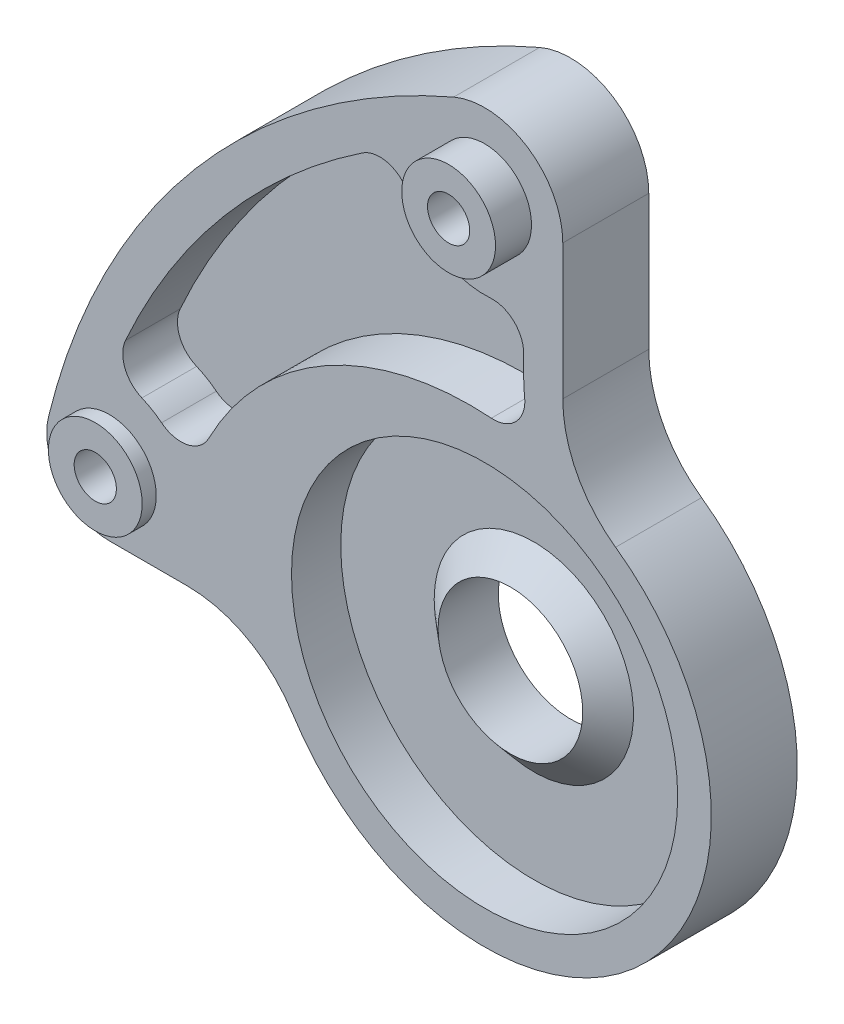
ISO-10303-21;
HEADER;
FILE_DESCRIPTION(('STEP AP214'),'2;1');
FILE_NAME('part.step','',(''),(''),'','','');
FILE_SCHEMA(('AUTOMOTIVE_DESIGN { 1 0 10303 214 1 1 1 1 }'));
ENDSEC;
DATA;
#1=APPLICATION_CONTEXT('core data for automotive mechanical design processes');
#2=APPLICATION_PROTOCOL_DEFINITION('international standard','automotive_design',2000,#1);
#3=PRODUCT_CONTEXT('',#1,'mechanical');
#4=PRODUCT('Part','Part','',(#3));
#5=PRODUCT_RELATED_PRODUCT_CATEGORY('part','',(#4));
#6=PRODUCT_DEFINITION_FORMATION('','',#4);
#7=PRODUCT_DEFINITION_CONTEXT('part definition',#1,'design');
#8=PRODUCT_DEFINITION('design','',#6,#7);
#9=PRODUCT_DEFINITION_SHAPE('','',#8);
#10=(LENGTH_UNIT() NAMED_UNIT(*) SI_UNIT(.MILLI.,.METRE.));
#11=(NAMED_UNIT(*) PLANE_ANGLE_UNIT() SI_UNIT($,.RADIAN.));
#12=(NAMED_UNIT(*) SI_UNIT($,.STERADIAN.) SOLID_ANGLE_UNIT());
#13=UNCERTAINTY_MEASURE_WITH_UNIT(LENGTH_MEASURE(1.E-05),#10,'distance_accuracy_value','');
#14=(GEOMETRIC_REPRESENTATION_CONTEXT(3) GLOBAL_UNCERTAINTY_ASSIGNED_CONTEXT((#13)) GLOBAL_UNIT_ASSIGNED_CONTEXT((#10,
#11,#12)) REPRESENTATION_CONTEXT('',''));
#15=CARTESIAN_POINT('',(0.,0.,0.));
#16=DIRECTION('',(0.,0.,1.));
#17=DIRECTION('',(1.,0.,0.));
#18=AXIS2_PLACEMENT_3D('',#15,#16,#17);
#19=CARTESIAN_POINT('',(0.,0.,2.35));
#20=DIRECTION('',(0.,0.,-1.));
#21=DIRECTION('',(-1.,0.,0.));
#22=AXIS2_PLACEMENT_3D('',#19,#20,#21);
#23=PLANE('',#22);
#24=CARTESIAN_POINT('',(0.,0.,2.35));
#25=DIRECTION('',(0.,0.,1.));
#26=DIRECTION('',(-1.,0.,0.));
#27=AXIS2_PLACEMENT_3D('',#24,#25,#26);
#28=CIRCLE('',#27,12.35);
#29=CARTESIAN_POINT('',(-12.35,0.,2.35));
#30=VERTEX_POINT('',#29);
#31=EDGE_CURVE('E199',#30,#30,#28,.T.);
#32=ORIENTED_EDGE('',*,*,#31,.T.);
#33=EDGE_LOOP('',(#32));
#34=FACE_BOUND('',#33,.T.);
#35=CARTESIAN_POINT('',(0.,0.,2.35));
#36=DIRECTION('',(0.,0.,-1.));
#37=DIRECTION('',(-1.,0.,0.));
#38=AXIS2_PLACEMENT_3D('',#35,#36,#37);
#39=CIRCLE('',#38,6.375);
#40=CARTESIAN_POINT('',(-6.375,0.,2.35));
#41=VERTEX_POINT('',#40);
#42=EDGE_CURVE('E11',#41,#41,#39,.F.);
#43=ORIENTED_EDGE('',*,*,#42,.F.);
#44=EDGE_LOOP('',(#43));
#45=FACE_BOUND('',#44,.T.);
#46=ADVANCED_FACE('F33',(#34,#45),#23,.F.);
#47=CARTESIAN_POINT('',(0.,0.,5.5));
#48=DIRECTION('',(0.,0.,1.));
#49=DIRECTION('',(1.,0.,0.));
#50=AXIS2_PLACEMENT_3D('',#47,#48,#49);
#51=PLANE('',#50);
#52=CARTESIAN_POINT('',(0.,0.,5.5));
#53=DIRECTION('',(0.,0.,1.));
#54=DIRECTION('',(1.,0.,0.));
#55=AXIS2_PLACEMENT_3D('',#52,#53,#54);
#56=CIRCLE('',#55,14.5);
#57=CARTESIAN_POINT('',(-12.2656249557679,-7.73333333333334,5.5));
#58=VERTEX_POINT('',#57);
#59=CARTESIAN_POINT('',(8.3777777777777,11.834814722089,5.5));
#60=VERTEX_POINT('',#59);
#61=EDGE_CURVE('E145',#58,#60,#56,.T.);
#62=ORIENTED_EDGE('',*,*,#61,.T.);
#63=CARTESIAN_POINT('',(13.,18.364367672207,5.5));
#64=DIRECTION('',(0.,0.,-1.));
#65=DIRECTION('',(-1.,0.,0.));
#66=AXIS2_PLACEMENT_3D('',#63,#64,#65);
#67=CIRCLE('',#66,8.00000000000009);
#68=CARTESIAN_POINT('',(4.99999999999991,18.364367672207,5.5));
#69=VERTEX_POINT('',#68);
#70=EDGE_CURVE('E148',#60,#69,#67,.T.);
#71=ORIENTED_EDGE('',*,*,#70,.T.);
#72=DIRECTION('',(0.,1.,0.));
#73=VECTOR('',#72,1.);
#74=CARTESIAN_POINT('',(4.9999999999999,18.364367672207,5.5));
#75=LINE('',#74,#73);
#76=CARTESIAN_POINT('',(4.9999999999999,27.,5.5));
#77=VERTEX_POINT('',#76);
#78=EDGE_CURVE('E152',#69,#77,#75,.T.);
#79=ORIENTED_EDGE('',*,*,#78,.T.);
#80=CARTESIAN_POINT('',(-1.0088308886416E-13,27.,5.5));
#81=DIRECTION('',(0.,0.,1.));
#82=DIRECTION('',(1.,0.,0.));
#83=AXIS2_PLACEMENT_3D('',#80,#81,#82);
#84=CIRCLE('',#83,4.99999999999999);
#85=CARTESIAN_POINT('',(-1.97842357937317,31.5919320705538,5.5));
#86=VERTEX_POINT('',#85);
#87=EDGE_CURVE('E155',#77,#86,#84,.T.);
#88=ORIENTED_EDGE('',*,*,#87,.T.);
#89=CARTESIAN_POINT('',(15.8273886349844,-9.73545656443054,5.5));
#90=DIRECTION('',(0.,0.,1.));
#91=DIRECTION('',(1.,0.,0.));
#92=AXIS2_PLACEMENT_3D('',#89,#90,#91);
#93=CIRCLE('',#92,45.);
#94=CARTESIAN_POINT('',(-27.885598891218,0.949800640432248,5.5));
#95=VERTEX_POINT('',#94);
#96=EDGE_CURVE('E158',#86,#95,#93,.T.);
#97=ORIENTED_EDGE('',*,*,#96,.T.);
#98=CARTESIAN_POINT('',(-24.,0.,5.5));
#99=DIRECTION('',(0.,0.,1.));
#100=DIRECTION('',(1.,0.,0.));
#101=AXIS2_PLACEMENT_3D('',#98,#99,#100);
#102=CIRCLE('',#101,4.);
#103=CARTESIAN_POINT('',(-24.,-4.,5.5));
#104=VERTEX_POINT('',#103);
#105=EDGE_CURVE('E161',#95,#104,#102,.T.);
#106=ORIENTED_EDGE('',*,*,#105,.T.);
#107=DIRECTION('',(1.,0.,0.));
#108=VECTOR('',#107,1.);
#109=CARTESIAN_POINT('',(-24.,-4.,5.5));
#110=LINE('',#109,#108);
#111=CARTESIAN_POINT('',(-19.0328663106743,-4.,5.5));
#112=VERTEX_POINT('',#111);
#113=EDGE_CURVE('E121',#104,#112,#110,.T.);
#114=ORIENTED_EDGE('',*,*,#113,.T.);
#115=CARTESIAN_POINT('',(-19.0328663106743,-12.,5.5));
#116=DIRECTION('',(0.,0.,-1.));
#117=DIRECTION('',(-1.,0.,0.));
#118=AXIS2_PLACEMENT_3D('',#115,#116,#117);
#119=CIRCLE('',#118,8.00000000000001);
#120=EDGE_CURVE('E164',#112,#58,#119,.T.);
#121=ORIENTED_EDGE('',*,*,#120,.T.);
#122=EDGE_LOOP('',(#62,#71,#79,#88,#97,#106,#114,#121));
#123=FACE_BOUND('',#122,.T.);
#124=CARTESIAN_POINT('',(-1.00613961606655E-13,27.,5.5));
#125=DIRECTION('',(0.,0.,1.));
#126=DIRECTION('',(1.,0.,0.));
#127=AXIS2_PLACEMENT_3D('',#124,#125,#126);
#128=CIRCLE('',#127,3.);
#129=CARTESIAN_POINT('',(2.9999999999999,27.,5.5));
#130=VERTEX_POINT('',#129);
#131=EDGE_CURVE('E204',#130,#130,#128,.T.);
#132=ORIENTED_EDGE('',*,*,#131,.F.);
#133=EDGE_LOOP('',(#132));
#134=FACE_BOUND('',#133,.T.);
#135=CARTESIAN_POINT('',(-24.,0.,5.5));
#136=DIRECTION('',(0.,0.,1.));
#137=DIRECTION('',(1.,0.,0.));
#138=AXIS2_PLACEMENT_3D('',#135,#136,#137);
#139=CIRCLE('',#138,3.);
#140=CARTESIAN_POINT('',(-21.,0.,5.5));
#141=VERTEX_POINT('',#140);
#142=EDGE_CURVE('E184',#141,#141,#139,.T.);
#143=ORIENTED_EDGE('',*,*,#142,.F.);
#144=EDGE_LOOP('',(#143));
#145=FACE_BOUND('',#144,.T.);
#146=CARTESIAN_POINT('',(0.,0.,5.5));
#147=DIRECTION('',(0.,0.,1.));
#148=DIRECTION('',(-1.,0.,0.));
#149=AXIS2_PLACEMENT_3D('',#146,#147,#148);
#150=CIRCLE('',#149,12.35);
#151=CARTESIAN_POINT('',(-12.35,0.,5.5));
#152=VERTEX_POINT('',#151);
#153=EDGE_CURVE('E195',#152,#152,#150,.T.);
#154=ORIENTED_EDGE('',*,*,#153,.F.);
#155=EDGE_LOOP('',(#154));
#156=FACE_BOUND('',#155,.T.);
#157=CARTESIAN_POINT('',(0.499999999999904,19.6403211148632,5.5));
#158=DIRECTION('',(0.,0.,1.));
#159=DIRECTION('',(1.,0.,0.));
#160=AXIS2_PLACEMENT_3D('',#157,#158,#159);
#161=CIRCLE('',#160,1.99999999999999);
#162=CARTESIAN_POINT('',(2.4999999999999,19.6403211148632,5.5));
#163=VERTEX_POINT('',#162);
#164=CARTESIAN_POINT('',(0.364436994473665,21.6357214936175,5.5));
#165=VERTEX_POINT('',#164);
#166=EDGE_CURVE('E48',#163,#165,#161,.T.);
#167=ORIENTED_EDGE('',*,*,#166,.F.);
#168=DIRECTION('',(0.,1.,0.));
#169=VECTOR('',#168,1.);
#170=CARTESIAN_POINT('',(2.4999999999999,18.364367672207,5.5));
#171=LINE('',#170,#169);
#172=CARTESIAN_POINT('',(2.4999999999999,18.364367672207,5.5));
#173=VERTEX_POINT('',#172);
#174=EDGE_CURVE('E305',#173,#163,#171,.T.);
#175=ORIENTED_EDGE('',*,*,#174,.F.);
#176=CARTESIAN_POINT('',(13.,18.364367672207,5.5));
#177=DIRECTION('',(0.,0.,-1.));
#178=DIRECTION('',(-1.,0.,0.));
#179=AXIS2_PLACEMENT_3D('',#176,#177,#178);
#180=CIRCLE('',#179,10.5000000000001);
#181=CARTESIAN_POINT('',(2.56193267128369,17.2256181645507,5.5));
#182=VERTEX_POINT('',#181);
#183=EDGE_CURVE('E359',#182,#173,#180,.T.);
#184=ORIENTED_EDGE('',*,*,#183,.F.);
#185=CARTESIAN_POINT('',(0.573729370575846,17.0087134964257,5.5));
#186=DIRECTION('',(0.,0.,1.));
#187=DIRECTION('',(1.,0.,0.));
#188=AXIS2_PLACEMENT_3D('',#185,#186,#187);
#189=CIRCLE('',#188,1.99999999999999);
#190=CARTESIAN_POINT('',(0.431762956453784,15.0137584750628,5.5));
#191=VERTEX_POINT('',#190);
#192=EDGE_CURVE('E356',#191,#182,#189,.T.);
#193=ORIENTED_EDGE('',*,*,#192,.F.);
#194=CARTESIAN_POINT('',(-0.904677725958615,-3.76631050547785,5.5));
#195=DIRECTION('',(0.,0.,-1.));
#196=DIRECTION('',(-1.,0.,0.));
#197=AXIS2_PLACEMENT_3D('',#194,#195,#196);
#198=CIRCLE('',#197,18.8275613028207);
#199=CARTESIAN_POINT('',(-17.638370064666,4.86274537132348,5.5));
#200=VERTEX_POINT('',#199);
#201=EDGE_CURVE('E353',#200,#191,#198,.T.);
#202=ORIENTED_EDGE('',*,*,#201,.F.);
#203=CARTESIAN_POINT('',(-19.4159441295769,5.77938621906922,5.5));
#204=DIRECTION('',(0.,0.,1.));
#205=DIRECTION('',(1.,0.,0.));
#206=AXIS2_PLACEMENT_3D('',#203,#204,#205);
#207=CIRCLE('',#206,2.00000000000001);
#208=CARTESIAN_POINT('',(-20.6588009121664,4.21244428716133,5.5));
#209=VERTEX_POINT('',#208);
#210=EDGE_CURVE('E350',#209,#200,#207,.T.);
#211=ORIENTED_EDGE('',*,*,#210,.F.);
#212=CARTESIAN_POINT('',(-24.,0.,5.5));
#213=DIRECTION('',(0.,0.,-1.));
#214=DIRECTION('',(-1.,0.,0.));
#215=AXIS2_PLACEMENT_3D('',#212,#213,#214);
#216=CIRCLE('',#215,5.37664376883742);
#217=CARTESIAN_POINT('',(-21.9175143188085,4.95697000239168,5.5));
#218=VERTEX_POINT('',#217);
#219=EDGE_CURVE('E347',#218,#209,#216,.T.);
#220=ORIENTED_EDGE('',*,*,#219,.F.);
#221=CARTESIAN_POINT('',(-21.1428728246998,6.80086006299858,5.5));
#222=DIRECTION('',(0.,0.,1.));
#223=DIRECTION('',(1.,0.,0.));
#224=AXIS2_PLACEMENT_3D('',#221,#222,#223);
#225=CIRCLE('',#224,1.99999999999999);
#226=CARTESIAN_POINT('',(-22.9685647486348,7.6174682915136,5.5));
#227=VERTEX_POINT('',#226);
#228=EDGE_CURVE('E344',#227,#218,#225,.T.);
#229=ORIENTED_EDGE('',*,*,#228,.F.);
#230=CARTESIAN_POINT('',(15.8273886349844,-9.73545656443054,5.5));
#231=DIRECTION('',(0.,0.,1.));
#232=DIRECTION('',(1.,0.,0.));
#233=AXIS2_PLACEMENT_3D('',#230,#231,#232);
#234=CIRCLE('',#233,42.5);
#235=CARTESIAN_POINT('',(-7.81518917586899,25.5813739057255,5.5));
#236=VERTEX_POINT('',#235);
#237=EDGE_CURVE('E341',#236,#227,#234,.T.);
#238=ORIENTED_EDGE('',*,*,#237,.F.);
#239=CARTESIAN_POINT('',(-6.70259727888763,23.9194054130123,5.5));
#240=DIRECTION('',(0.,0.,1.));
#241=DIRECTION('',(1.,0.,0.));
#242=AXIS2_PLACEMENT_3D('',#239,#240,#241);
#243=CIRCLE('',#242,2.00000000000001);
#244=CARTESIAN_POINT('',(-4.88534881497165,24.7546347350521,5.5));
#245=VERTEX_POINT('',#244);
#246=EDGE_CURVE('E338',#245,#236,#243,.T.);
#247=ORIENTED_EDGE('',*,*,#246,.F.);
#248=CARTESIAN_POINT('',(-1.0088308886416E-13,27.,5.5));
#249=DIRECTION('',(0.,0.,-1.));
#250=DIRECTION('',(-1.,0.,0.));
#251=AXIS2_PLACEMENT_3D('',#248,#249,#250);
#252=CIRCLE('',#251,5.37664376883742);
#253=EDGE_CURVE('E298',#165,#245,#252,.T.);
#254=ORIENTED_EDGE('',*,*,#253,.F.);
#255=EDGE_LOOP('',(#167,#175,#184,#193,#202,#211,#220,#229,#238,#247,#254));
#256=FACE_BOUND('',#255,.T.);
#257=ADVANCED_FACE('F229',(#123,#134,#145,#156,#256),#51,.T.);
#258=CARTESIAN_POINT('',(0.,0.,0.));
#259=DIRECTION('',(0.,0.,1.));
#260=DIRECTION('',(1.,0.,0.));
#261=AXIS2_PLACEMENT_3D('',#258,#259,#260);
#262=CYLINDRICAL_SURFACE('',#261,14.5);
#263=ORIENTED_EDGE('',*,*,#61,.F.);
#264=DIRECTION('',(0.,0.,1.));
#265=VECTOR('',#264,1.);
#266=CARTESIAN_POINT('',(-12.2656249557679,-7.73333333333334,0.));
#267=LINE('',#266,#265);
#268=CARTESIAN_POINT('',(-12.2656249557679,-7.73333333333334,0.));
#269=VERTEX_POINT('',#268);
#270=EDGE_CURVE('E41',#269,#58,#267,.T.);
#271=ORIENTED_EDGE('',*,*,#270,.F.);
#272=CARTESIAN_POINT('',(0.,0.,0.));
#273=DIRECTION('',(0.,0.,1.));
#274=DIRECTION('',(1.,0.,0.));
#275=AXIS2_PLACEMENT_3D('',#272,#273,#274);
#276=CIRCLE('',#275,14.5);
#277=CARTESIAN_POINT('',(8.3777777777777,11.834814722089,0.));
#278=VERTEX_POINT('',#277);
#279=EDGE_CURVE('E167',#269,#278,#276,.T.);
#280=ORIENTED_EDGE('',*,*,#279,.T.);
#281=DIRECTION('',(0.,0.,1.));
#282=VECTOR('',#281,1.);
#283=CARTESIAN_POINT('',(8.3777777777777,11.834814722089,0.));
#284=LINE('',#283,#282);
#285=EDGE_CURVE('E95',#278,#60,#284,.T.);
#286=ORIENTED_EDGE('',*,*,#285,.T.);
#287=EDGE_LOOP('',(#263,#271,#280,#286));
#288=FACE_BOUND('',#287,.T.);
#289=ADVANCED_FACE('F227',(#288),#262,.T.);
#290=CARTESIAN_POINT('',(-19.0328663106743,-12.,0.));
#291=DIRECTION('',(0.,0.,1.));
#292=DIRECTION('',(1.,0.,0.));
#293=AXIS2_PLACEMENT_3D('',#290,#291,#292);
#294=CYLINDRICAL_SURFACE('',#293,8.00000000000001);
#295=ORIENTED_EDGE('',*,*,#120,.F.);
#296=DIRECTION('',(0.,0.,1.));
#297=VECTOR('',#296,1.);
#298=CARTESIAN_POINT('',(-19.0328663106743,-4.,0.));
#299=LINE('',#298,#297);
#300=CARTESIAN_POINT('',(-19.0328663106743,-4.,0.));
#301=VERTEX_POINT('',#300);
#302=EDGE_CURVE('E126',#301,#112,#299,.T.);
#303=ORIENTED_EDGE('',*,*,#302,.F.);
#304=CARTESIAN_POINT('',(-19.0328663106743,-12.,0.));
#305=DIRECTION('',(0.,0.,-1.));
#306=DIRECTION('',(-1.,0.,0.));
#307=AXIS2_PLACEMENT_3D('',#304,#305,#306);
#308=CIRCLE('',#307,8.00000000000001);
#309=EDGE_CURVE('E135',#301,#269,#308,.T.);
#310=ORIENTED_EDGE('',*,*,#309,.T.);
#311=ORIENTED_EDGE('',*,*,#270,.T.);
#312=EDGE_LOOP('',(#295,#303,#310,#311));
#313=FACE_BOUND('',#312,.T.);
#314=ADVANCED_FACE('F231',(#313),#294,.F.);
#315=CARTESIAN_POINT('',(-24.,-4.,0.));
#316=DIRECTION('',(0.,-1.,0.));
#317=DIRECTION('',(0.,0.,-1.));
#318=AXIS2_PLACEMENT_3D('',#315,#316,#317);
#319=PLANE('',#318);
#320=ORIENTED_EDGE('',*,*,#113,.F.);
#321=DIRECTION('',(0.,0.,1.));
#322=VECTOR('',#321,1.);
#323=CARTESIAN_POINT('',(-24.,-4.,0.));
#324=LINE('',#323,#322);
#325=CARTESIAN_POINT('',(-24.,-4.,0.));
#326=VERTEX_POINT('',#325);
#327=EDGE_CURVE('E115',#326,#104,#324,.T.);
#328=ORIENTED_EDGE('',*,*,#327,.F.);
#329=DIRECTION('',(1.,0.,0.));
#330=VECTOR('',#329,1.);
#331=CARTESIAN_POINT('',(-24.,-4.,0.));
#332=LINE('',#331,#330);
#333=EDGE_CURVE('E118',#326,#301,#332,.T.);
#334=ORIENTED_EDGE('',*,*,#333,.T.);
#335=ORIENTED_EDGE('',*,*,#302,.T.);
#336=EDGE_LOOP('',(#320,#328,#334,#335));
#337=FACE_BOUND('',#336,.T.);
#338=ADVANCED_FACE('F117',(#337),#319,.T.);
#339=CARTESIAN_POINT('',(-24.,0.,0.));
#340=DIRECTION('',(0.,0.,1.));
#341=DIRECTION('',(1.,0.,0.));
#342=AXIS2_PLACEMENT_3D('',#339,#340,#341);
#343=CYLINDRICAL_SURFACE('',#342,4.);
#344=ORIENTED_EDGE('',*,*,#105,.F.);
#345=DIRECTION('',(0.,0.,1.));
#346=VECTOR('',#345,1.);
#347=CARTESIAN_POINT('',(-27.885598891218,0.949800640432248,0.));
#348=LINE('',#347,#346);
#349=CARTESIAN_POINT('',(-27.885598891218,0.949800640432248,0.));
#350=VERTEX_POINT('',#349);
#351=EDGE_CURVE('E127',#350,#95,#348,.T.);
#352=ORIENTED_EDGE('',*,*,#351,.F.);
#353=CARTESIAN_POINT('',(-24.,0.,0.));
#354=DIRECTION('',(0.,0.,1.));
#355=DIRECTION('',(1.,0.,0.));
#356=AXIS2_PLACEMENT_3D('',#353,#354,#355);
#357=CIRCLE('',#356,4.);
#358=EDGE_CURVE('E133',#350,#326,#357,.T.);
#359=ORIENTED_EDGE('',*,*,#358,.T.);
#360=ORIENTED_EDGE('',*,*,#327,.T.);
#361=EDGE_LOOP('',(#344,#352,#359,#360));
#362=FACE_BOUND('',#361,.T.);
#363=ADVANCED_FACE('F137',(#362),#343,.T.);
#364=CARTESIAN_POINT('',(15.8273886349844,-9.73545656443054,0.));
#365=DIRECTION('',(0.,0.,1.));
#366=DIRECTION('',(1.,0.,0.));
#367=AXIS2_PLACEMENT_3D('',#364,#365,#366);
#368=CYLINDRICAL_SURFACE('',#367,45.);
#369=ORIENTED_EDGE('',*,*,#96,.F.);
#370=DIRECTION('',(0.,0.,1.));
#371=VECTOR('',#370,1.);
#372=CARTESIAN_POINT('',(-1.97842357937317,31.5919320705538,0.));
#373=LINE('',#372,#371);
#374=CARTESIAN_POINT('',(-1.97842357937317,31.5919320705538,0.));
#375=VERTEX_POINT('',#374);
#376=EDGE_CURVE('E171',#375,#86,#373,.T.);
#377=ORIENTED_EDGE('',*,*,#376,.F.);
#378=CARTESIAN_POINT('',(15.8273886349844,-9.73545656443054,0.));
#379=DIRECTION('',(0.,0.,1.));
#380=DIRECTION('',(1.,0.,0.));
#381=AXIS2_PLACEMENT_3D('',#378,#379,#380);
#382=CIRCLE('',#381,45.);
#383=EDGE_CURVE('E138',#375,#350,#382,.T.);
#384=ORIENTED_EDGE('',*,*,#383,.T.);
#385=ORIENTED_EDGE('',*,*,#351,.T.);
#386=EDGE_LOOP('',(#369,#377,#384,#385));
#387=FACE_BOUND('',#386,.T.);
#388=ADVANCED_FACE('F663',(#387),#368,.T.);
#389=CARTESIAN_POINT('',(-1.0088308886416E-13,27.,0.));
#390=DIRECTION('',(0.,0.,1.));
#391=DIRECTION('',(1.,0.,0.));
#392=AXIS2_PLACEMENT_3D('',#389,#390,#391);
#393=CYLINDRICAL_SURFACE('',#392,4.99999999999999);
#394=ORIENTED_EDGE('',*,*,#87,.F.);
#395=DIRECTION('',(0.,0.,1.));
#396=VECTOR('',#395,1.);
#397=CARTESIAN_POINT('',(4.9999999999999,27.,0.));
#398=LINE('',#397,#396);
#399=CARTESIAN_POINT('',(4.9999999999999,27.,0.));
#400=VERTEX_POINT('',#399);
#401=EDGE_CURVE('E173',#400,#77,#398,.T.);
#402=ORIENTED_EDGE('',*,*,#401,.F.);
#403=CARTESIAN_POINT('',(-1.0088308886416E-13,27.,0.));
#404=DIRECTION('',(0.,0.,1.));
#405=DIRECTION('',(1.,0.,0.));
#406=AXIS2_PLACEMENT_3D('',#403,#404,#405);
#407=CIRCLE('',#406,4.99999999999999);
#408=EDGE_CURVE('E140',#400,#375,#407,.T.);
#409=ORIENTED_EDGE('',*,*,#408,.T.);
#410=ORIENTED_EDGE('',*,*,#376,.T.);
#411=EDGE_LOOP('',(#394,#402,#409,#410));
#412=FACE_BOUND('',#411,.T.);
#413=ADVANCED_FACE('F220',(#412),#393,.T.);
#414=CARTESIAN_POINT('',(4.9999999999999,18.364367672207,0.));
#415=DIRECTION('',(1.,0.,0.));
#416=DIRECTION('',(0.,0.,-1.));
#417=AXIS2_PLACEMENT_3D('',#414,#415,#416);
#418=PLANE('',#417);
#419=ORIENTED_EDGE('',*,*,#78,.F.);
#420=DIRECTION('',(0.,0.,1.));
#421=VECTOR('',#420,1.);
#422=CARTESIAN_POINT('',(4.99999999999991,18.364367672207,0.));
#423=LINE('',#422,#421);
#424=CARTESIAN_POINT('',(4.99999999999991,18.364367672207,0.));
#425=VERTEX_POINT('',#424);
#426=EDGE_CURVE('E175',#425,#69,#423,.T.);
#427=ORIENTED_EDGE('',*,*,#426,.F.);
#428=DIRECTION('',(0.,1.,0.));
#429=VECTOR('',#428,1.);
#430=CARTESIAN_POINT('',(4.9999999999999,18.364367672207,0.));
#431=LINE('',#430,#429);
#432=EDGE_CURVE('E214',#425,#400,#431,.T.);
#433=ORIENTED_EDGE('',*,*,#432,.T.);
#434=ORIENTED_EDGE('',*,*,#401,.T.);
#435=EDGE_LOOP('',(#419,#427,#433,#434));
#436=FACE_BOUND('',#435,.T.);
#437=ADVANCED_FACE('F225',(#436),#418,.T.);
#438=CARTESIAN_POINT('',(13.,18.364367672207,0.));
#439=DIRECTION('',(0.,0.,1.));
#440=DIRECTION('',(1.,0.,0.));
#441=AXIS2_PLACEMENT_3D('',#438,#439,#440);
#442=CYLINDRICAL_SURFACE('',#441,8.00000000000009);
#443=ORIENTED_EDGE('',*,*,#70,.F.);
#444=ORIENTED_EDGE('',*,*,#285,.F.);
#445=CARTESIAN_POINT('',(13.,18.364367672207,0.));
#446=DIRECTION('',(0.,0.,-1.));
#447=DIRECTION('',(-1.,0.,0.));
#448=AXIS2_PLACEMENT_3D('',#445,#446,#447);
#449=CIRCLE('',#448,8.00000000000009);
#450=EDGE_CURVE('E212',#278,#425,#449,.T.);
#451=ORIENTED_EDGE('',*,*,#450,.T.);
#452=ORIENTED_EDGE('',*,*,#426,.T.);
#453=EDGE_LOOP('',(#443,#444,#451,#452));
#454=FACE_BOUND('',#453,.T.);
#455=ADVANCED_FACE('F226',(#454),#442,.F.);
#456=CARTESIAN_POINT('',(0.,0.,0.));
#457=DIRECTION('',(0.,0.,1.));
#458=DIRECTION('',(1.,0.,0.));
#459=AXIS2_PLACEMENT_3D('',#456,#457,#458);
#460=PLANE('',#459);
#461=CARTESIAN_POINT('',(-1.01047642475649E-13,27.,0.));
#462=DIRECTION('',(0.,0.,1.));
#463=DIRECTION('',(-1.,0.,0.));
#464=AXIS2_PLACEMENT_3D('',#461,#462,#463);
#465=CIRCLE('',#464,1.35);
#466=CARTESIAN_POINT('',(-1.3500000000001,27.,0.));
#467=VERTEX_POINT('',#466);
#468=EDGE_CURVE('E180',#467,#467,#465,.T.);
#469=ORIENTED_EDGE('',*,*,#468,.T.);
#470=EDGE_LOOP('',(#469));
#471=FACE_BOUND('',#470,.T.);
#472=CARTESIAN_POINT('',(-24.,0.,0.));
#473=DIRECTION('',(0.,0.,1.));
#474=DIRECTION('',(-1.,0.,0.));
#475=AXIS2_PLACEMENT_3D('',#472,#473,#474);
#476=CIRCLE('',#475,1.35);
#477=CARTESIAN_POINT('',(-25.35,0.,0.));
#478=VERTEX_POINT('',#477);
#479=EDGE_CURVE('E192',#478,#478,#476,.T.);
#480=ORIENTED_EDGE('',*,*,#479,.T.);
#481=EDGE_LOOP('',(#480));
#482=FACE_BOUND('',#481,.T.);
#483=CARTESIAN_POINT('',(0.,0.,0.));
#484=DIRECTION('',(0.,0.,-1.));
#485=DIRECTION('',(1.,0.,0.));
#486=AXIS2_PLACEMENT_3D('',#483,#484,#485);
#487=CIRCLE('',#486,4.625);
#488=CARTESIAN_POINT('',(4.625,0.,0.));
#489=VERTEX_POINT('',#488);
#490=EDGE_CURVE('E179',#489,#489,#487,.T.);
#491=ORIENTED_EDGE('',*,*,#490,.F.);
#492=EDGE_LOOP('',(#491));
#493=FACE_BOUND('',#492,.T.);
#494=ORIENTED_EDGE('',*,*,#279,.F.);
#495=ORIENTED_EDGE('',*,*,#309,.F.);
#496=ORIENTED_EDGE('',*,*,#333,.F.);
#497=ORIENTED_EDGE('',*,*,#358,.F.);
#498=ORIENTED_EDGE('',*,*,#383,.F.);
#499=ORIENTED_EDGE('',*,*,#408,.F.);
#500=ORIENTED_EDGE('',*,*,#432,.F.);
#501=ORIENTED_EDGE('',*,*,#450,.F.);
#502=EDGE_LOOP('',(#494,#495,#496,#497,#498,#499,#500,#501));
#503=FACE_BOUND('',#502,.T.);
#504=ADVANCED_FACE('F131',(#471,#482,#493,#503),#460,.F.);
#505=CARTESIAN_POINT('',(-1.00613961606655E-13,27.,7.8));
#506=DIRECTION('',(0.,0.,-1.));
#507=DIRECTION('',(-1.,0.,0.));
#508=AXIS2_PLACEMENT_3D('',#505,#506,#507);
#509=CYLINDRICAL_SURFACE('',#508,3.);
#510=CARTESIAN_POINT('',(-1.00613961606655E-13,27.,7.8));
#511=DIRECTION('',(0.,0.,1.));
#512=DIRECTION('',(1.,0.,0.));
#513=AXIS2_PLACEMENT_3D('',#510,#511,#512);
#514=CIRCLE('',#513,3.);
#515=CARTESIAN_POINT('',(2.9999999999999,27.,7.8));
#516=VERTEX_POINT('',#515);
#517=EDGE_CURVE('E149',#516,#516,#514,.T.);
#518=ORIENTED_EDGE('',*,*,#517,.F.);
#519=EDGE_LOOP('',(#518));
#520=FACE_BOUND('',#519,.T.);
#521=ORIENTED_EDGE('',*,*,#131,.T.);
#522=EDGE_LOOP('',(#521));
#523=FACE_BOUND('',#522,.T.);
#524=ADVANCED_FACE('F278',(#520,#523),#509,.T.);
#525=CARTESIAN_POINT('',(-1.00613961606655E-13,27.,7.8));
#526=DIRECTION('',(0.,0.,1.));
#527=DIRECTION('',(1.,0.,0.));
#528=AXIS2_PLACEMENT_3D('',#525,#526,#527);
#529=PLANE('',#528);
#530=CARTESIAN_POINT('',(-1.01047642475649E-13,27.,7.8));
#531=DIRECTION('',(0.,0.,1.));
#532=DIRECTION('',(-1.,0.,0.));
#533=AXIS2_PLACEMENT_3D('',#530,#531,#532);
#534=CIRCLE('',#533,1.35);
#535=CARTESIAN_POINT('',(-1.3500000000001,27.,7.8));
#536=VERTEX_POINT('',#535);
#537=EDGE_CURVE('E187',#536,#536,#534,.T.);
#538=ORIENTED_EDGE('',*,*,#537,.F.);
#539=EDGE_LOOP('',(#538));
#540=FACE_BOUND('',#539,.T.);
#541=ORIENTED_EDGE('',*,*,#517,.T.);
#542=EDGE_LOOP('',(#541));
#543=FACE_BOUND('',#542,.T.);
#544=ADVANCED_FACE('F274',(#540,#543),#529,.T.);
#545=CARTESIAN_POINT('',(-24.,0.,6.4));
#546=DIRECTION('',(0.,0.,-1.));
#547=DIRECTION('',(-1.,0.,0.));
#548=AXIS2_PLACEMENT_3D('',#545,#546,#547);
#549=CYLINDRICAL_SURFACE('',#548,3.);
#550=CARTESIAN_POINT('',(-24.,0.,6.4));
#551=DIRECTION('',(0.,0.,1.));
#552=DIRECTION('',(1.,0.,0.));
#553=AXIS2_PLACEMENT_3D('',#550,#551,#552);
#554=CIRCLE('',#553,3.);
#555=CARTESIAN_POINT('',(-21.,0.,6.4));
#556=VERTEX_POINT('',#555);
#557=EDGE_CURVE('E201',#556,#556,#554,.T.);
#558=ORIENTED_EDGE('',*,*,#557,.F.);
#559=EDGE_LOOP('',(#558));
#560=FACE_BOUND('',#559,.T.);
#561=ORIENTED_EDGE('',*,*,#142,.T.);
#562=EDGE_LOOP('',(#561));
#563=FACE_BOUND('',#562,.T.);
#564=ADVANCED_FACE('F270',(#560,#563),#549,.T.);
#565=CARTESIAN_POINT('',(-24.,0.,6.4));
#566=DIRECTION('',(0.,0.,1.));
#567=DIRECTION('',(1.,0.,0.));
#568=AXIS2_PLACEMENT_3D('',#565,#566,#567);
#569=PLANE('',#568);
#570=CARTESIAN_POINT('',(-24.,0.,6.4));
#571=DIRECTION('',(0.,0.,1.));
#572=DIRECTION('',(1.,0.,0.));
#573=AXIS2_PLACEMENT_3D('',#570,#571,#572);
#574=CIRCLE('',#573,1.35);
#575=CARTESIAN_POINT('',(-22.65,0.,6.4));
#576=VERTEX_POINT('',#575);
#577=EDGE_CURVE('E177',#576,#576,#574,.T.);
#578=ORIENTED_EDGE('',*,*,#577,.F.);
#579=EDGE_LOOP('',(#578));
#580=FACE_BOUND('',#579,.T.);
#581=ORIENTED_EDGE('',*,*,#557,.T.);
#582=EDGE_LOOP('',(#581));
#583=FACE_BOUND('',#582,.T.);
#584=ADVANCED_FACE('F266',(#580,#583),#569,.T.);
#585=CARTESIAN_POINT('',(0.,0.,7.8));
#586=DIRECTION('',(0.,0.,-1.));
#587=DIRECTION('',(-1.,0.,0.));
#588=AXIS2_PLACEMENT_3D('',#585,#586,#587);
#589=CYLINDRICAL_SURFACE('',#588,4.625);
#590=ORIENTED_EDGE('',*,*,#490,.T.);
#591=EDGE_LOOP('',(#590));
#592=FACE_BOUND('',#591,.T.);
#593=CARTESIAN_POINT('',(0.,0.,3.85));
#594=DIRECTION('',(0.,0.,1.));
#595=DIRECTION('',(1.,0.,0.));
#596=AXIS2_PLACEMENT_3D('',#593,#594,#595);
#597=CIRCLE('',#596,4.625);
#598=CARTESIAN_POINT('',(4.625,0.,3.85));
#599=VERTEX_POINT('',#598);
#600=EDGE_CURVE('E295',#599,#599,#597,.T.);
#601=ORIENTED_EDGE('',*,*,#600,.T.);
#602=EDGE_LOOP('',(#601));
#603=FACE_BOUND('',#602,.T.);
#604=ADVANCED_FACE('F263',(#592,#603),#589,.F.);
#605=CARTESIAN_POINT('',(-24.,0.,0.));
#606=DIRECTION('',(0.,0.,1.));
#607=DIRECTION('',(1.,0.,0.));
#608=AXIS2_PLACEMENT_3D('',#605,#606,#607);
#609=CYLINDRICAL_SURFACE('',#608,1.35);
#610=ORIENTED_EDGE('',*,*,#577,.T.);
#611=EDGE_LOOP('',(#610));
#612=FACE_BOUND('',#611,.T.);
#613=ORIENTED_EDGE('',*,*,#479,.F.);
#614=EDGE_LOOP('',(#613));
#615=FACE_BOUND('',#614,.T.);
#616=ADVANCED_FACE('F259',(#612,#615),#609,.F.);
#617=CARTESIAN_POINT('',(-1.01047642475649E-13,27.,0.));
#618=DIRECTION('',(0.,0.,1.));
#619=DIRECTION('',(1.,0.,0.));
#620=AXIS2_PLACEMENT_3D('',#617,#618,#619);
#621=CYLINDRICAL_SURFACE('',#620,1.35);
#622=ORIENTED_EDGE('',*,*,#468,.F.);
#623=EDGE_LOOP('',(#622));
#624=FACE_BOUND('',#623,.T.);
#625=ORIENTED_EDGE('',*,*,#537,.T.);
#626=EDGE_LOOP('',(#625));
#627=FACE_BOUND('',#626,.T.);
#628=ADVANCED_FACE('F255',(#624,#627),#621,.F.);
#629=CARTESIAN_POINT('',(0.,0.,2.35));
#630=DIRECTION('',(0.,0.,1.));
#631=DIRECTION('',(1.,0.,0.));
#632=AXIS2_PLACEMENT_3D('',#629,#630,#631);
#633=CYLINDRICAL_SURFACE('',#632,12.35);
#634=ORIENTED_EDGE('',*,*,#31,.F.);
#635=EDGE_LOOP('',(#634));
#636=FACE_BOUND('',#635,.T.);
#637=ORIENTED_EDGE('',*,*,#153,.T.);
#638=EDGE_LOOP('',(#637));
#639=FACE_BOUND('',#638,.T.);
#640=ADVANCED_FACE('F252',(#636,#639),#633,.F.);
#641=CARTESIAN_POINT('',(0.499999999999904,19.6403211148632,2.));
#642=DIRECTION('',(0.,0.,1.));
#643=DIRECTION('',(1.,0.,0.));
#644=AXIS2_PLACEMENT_3D('',#641,#642,#643);
#645=CYLINDRICAL_SURFACE('',#644,1.99999999999999);
#646=ORIENTED_EDGE('',*,*,#166,.T.);
#647=DIRECTION('',(0.,0.,1.));
#648=VECTOR('',#647,1.);
#649=CARTESIAN_POINT('',(0.364436994473665,21.6357214936175,2.));
#650=LINE('',#649,#648);
#651=CARTESIAN_POINT('',(0.364436994473665,21.6357214936175,2.));
#652=VERTEX_POINT('',#651);
#653=EDGE_CURVE('E334',#652,#165,#650,.T.);
#654=ORIENTED_EDGE('',*,*,#653,.F.);
#655=CARTESIAN_POINT('',(0.499999999999904,19.6403211148632,2.));
#656=DIRECTION('',(0.,0.,1.));
#657=DIRECTION('',(1.,0.,0.));
#658=AXIS2_PLACEMENT_3D('',#655,#656,#657);
#659=CIRCLE('',#658,1.99999999999999);
#660=CARTESIAN_POINT('',(2.4999999999999,19.6403211148632,2.));
#661=VERTEX_POINT('',#660);
#662=EDGE_CURVE('E301',#661,#652,#659,.T.);
#663=ORIENTED_EDGE('',*,*,#662,.F.);
#664=DIRECTION('',(0.,0.,1.));
#665=VECTOR('',#664,1.);
#666=CARTESIAN_POINT('',(2.4999999999999,19.6403211148632,2.));
#667=LINE('',#666,#665);
#668=EDGE_CURVE('E364',#661,#163,#667,.T.);
#669=ORIENTED_EDGE('',*,*,#668,.T.);
#670=EDGE_LOOP('',(#646,#654,#663,#669));
#671=FACE_BOUND('',#670,.T.);
#672=ADVANCED_FACE('F250',(#671),#645,.F.);
#673=CARTESIAN_POINT('',(2.4999999999999,18.364367672207,2.));
#674=DIRECTION('',(1.,0.,0.));
#675=DIRECTION('',(0.,1.,0.));
#676=AXIS2_PLACEMENT_3D('',#673,#674,#675);
#677=PLANE('',#676);
#678=ORIENTED_EDGE('',*,*,#174,.T.);
#679=ORIENTED_EDGE('',*,*,#668,.F.);
#680=DIRECTION('',(0.,1.,0.));
#681=VECTOR('',#680,1.);
#682=CARTESIAN_POINT('',(2.4999999999999,18.364367672207,2.));
#683=LINE('',#682,#681);
#684=CARTESIAN_POINT('',(2.4999999999999,18.364367672207,2.));
#685=VERTEX_POINT('',#684);
#686=EDGE_CURVE('E332',#685,#661,#683,.T.);
#687=ORIENTED_EDGE('',*,*,#686,.F.);
#688=DIRECTION('',(0.,0.,1.));
#689=VECTOR('',#688,1.);
#690=CARTESIAN_POINT('',(2.4999999999999,18.364367672207,2.));
#691=LINE('',#690,#689);
#692=EDGE_CURVE('E366',#685,#173,#691,.T.);
#693=ORIENTED_EDGE('',*,*,#692,.T.);
#694=EDGE_LOOP('',(#678,#679,#687,#693));
#695=FACE_BOUND('',#694,.T.);
#696=ADVANCED_FACE('F464',(#695),#677,.F.);
#697=CARTESIAN_POINT('',(13.,18.364367672207,2.));
#698=DIRECTION('',(0.,0.,1.));
#699=DIRECTION('',(1.,0.,0.));
#700=AXIS2_PLACEMENT_3D('',#697,#698,#699);
#701=CYLINDRICAL_SURFACE('',#700,10.5000000000001);
#702=ORIENTED_EDGE('',*,*,#183,.T.);
#703=ORIENTED_EDGE('',*,*,#692,.F.);
#704=CARTESIAN_POINT('',(13.,18.364367672207,2.));
#705=DIRECTION('',(0.,0.,-1.));
#706=DIRECTION('',(-1.,0.,0.));
#707=AXIS2_PLACEMENT_3D('',#704,#705,#706);
#708=CIRCLE('',#707,10.5000000000001);
#709=CARTESIAN_POINT('',(2.56193267128369,17.2256181645507,2.));
#710=VERTEX_POINT('',#709);
#711=EDGE_CURVE('E329',#710,#685,#708,.T.);
#712=ORIENTED_EDGE('',*,*,#711,.F.);
#713=DIRECTION('',(0.,0.,1.));
#714=VECTOR('',#713,1.);
#715=CARTESIAN_POINT('',(2.56193267128369,17.2256181645507,2.));
#716=LINE('',#715,#714);
#717=EDGE_CURVE('E369',#710,#182,#716,.T.);
#718=ORIENTED_EDGE('',*,*,#717,.T.);
#719=EDGE_LOOP('',(#702,#703,#712,#718));
#720=FACE_BOUND('',#719,.T.);
#721=ADVANCED_FACE('F468',(#720),#701,.T.);
#722=CARTESIAN_POINT('',(0.573729370575846,17.0087134964257,2.));
#723=DIRECTION('',(0.,0.,1.));
#724=DIRECTION('',(1.,0.,0.));
#725=AXIS2_PLACEMENT_3D('',#722,#723,#724);
#726=CYLINDRICAL_SURFACE('',#725,1.99999999999999);
#727=ORIENTED_EDGE('',*,*,#192,.T.);
#728=ORIENTED_EDGE('',*,*,#717,.F.);
#729=CARTESIAN_POINT('',(0.573729370575846,17.0087134964257,2.));
#730=DIRECTION('',(0.,0.,1.));
#731=DIRECTION('',(1.,0.,0.));
#732=AXIS2_PLACEMENT_3D('',#729,#730,#731);
#733=CIRCLE('',#732,1.99999999999999);
#734=CARTESIAN_POINT('',(0.431762956453784,15.0137584750628,2.));
#735=VERTEX_POINT('',#734);
#736=EDGE_CURVE('E326',#735,#710,#733,.T.);
#737=ORIENTED_EDGE('',*,*,#736,.F.);
#738=DIRECTION('',(0.,0.,1.));
#739=VECTOR('',#738,1.);
#740=CARTESIAN_POINT('',(0.431762956453784,15.0137584750628,2.));
#741=LINE('',#740,#739);
#742=EDGE_CURVE('E372',#735,#191,#741,.T.);
#743=ORIENTED_EDGE('',*,*,#742,.T.);
#744=EDGE_LOOP('',(#727,#728,#737,#743));
#745=FACE_BOUND('',#744,.T.);
#746=ADVANCED_FACE('F473',(#745),#726,.F.);
#747=CARTESIAN_POINT('',(-0.904677725958615,-3.76631050547785,2.));
#748=DIRECTION('',(0.,0.,1.));
#749=DIRECTION('',(1.,0.,0.));
#750=AXIS2_PLACEMENT_3D('',#747,#748,#749);
#751=CYLINDRICAL_SURFACE('',#750,18.8275613028207);
#752=ORIENTED_EDGE('',*,*,#201,.T.);
#753=ORIENTED_EDGE('',*,*,#742,.F.);
#754=CARTESIAN_POINT('',(-0.904677725958615,-3.76631050547785,2.));
#755=DIRECTION('',(0.,0.,-1.));
#756=DIRECTION('',(-1.,0.,0.));
#757=AXIS2_PLACEMENT_3D('',#754,#755,#756);
#758=CIRCLE('',#757,18.8275613028207);
#759=CARTESIAN_POINT('',(-17.638370064666,4.86274537132348,2.));
#760=VERTEX_POINT('',#759);
#761=EDGE_CURVE('E323',#760,#735,#758,.T.);
#762=ORIENTED_EDGE('',*,*,#761,.F.);
#763=DIRECTION('',(0.,0.,1.));
#764=VECTOR('',#763,1.);
#765=CARTESIAN_POINT('',(-17.638370064666,4.86274537132348,2.));
#766=LINE('',#765,#764);
#767=EDGE_CURVE('E375',#760,#200,#766,.T.);
#768=ORIENTED_EDGE('',*,*,#767,.T.);
#769=EDGE_LOOP('',(#752,#753,#762,#768));
#770=FACE_BOUND('',#769,.T.);
#771=ADVANCED_FACE('F480',(#770),#751,.T.);
#772=CARTESIAN_POINT('',(-19.4159441295769,5.77938621906922,2.));
#773=DIRECTION('',(0.,0.,1.));
#774=DIRECTION('',(1.,0.,0.));
#775=AXIS2_PLACEMENT_3D('',#772,#773,#774);
#776=CYLINDRICAL_SURFACE('',#775,2.00000000000001);
#777=ORIENTED_EDGE('',*,*,#210,.T.);
#778=ORIENTED_EDGE('',*,*,#767,.F.);
#779=CARTESIAN_POINT('',(-19.4159441295769,5.77938621906922,2.));
#780=DIRECTION('',(0.,0.,1.));
#781=DIRECTION('',(1.,0.,0.));
#782=AXIS2_PLACEMENT_3D('',#779,#780,#781);
#783=CIRCLE('',#782,2.00000000000001);
#784=CARTESIAN_POINT('',(-20.6588009121664,4.21244428716133,2.));
#785=VERTEX_POINT('',#784);
#786=EDGE_CURVE('E320',#785,#760,#783,.T.);
#787=ORIENTED_EDGE('',*,*,#786,.F.);
#788=DIRECTION('',(0.,0.,1.));
#789=VECTOR('',#788,1.);
#790=CARTESIAN_POINT('',(-20.6588009121664,4.21244428716133,2.));
#791=LINE('',#790,#789);
#792=EDGE_CURVE('E378',#785,#209,#791,.T.);
#793=ORIENTED_EDGE('',*,*,#792,.T.);
#794=EDGE_LOOP('',(#777,#778,#787,#793));
#795=FACE_BOUND('',#794,.T.);
#796=ADVANCED_FACE('F484',(#795),#776,.F.);
#797=CARTESIAN_POINT('',(-24.,0.,2.));
#798=DIRECTION('',(0.,0.,1.));
#799=DIRECTION('',(1.,0.,0.));
#800=AXIS2_PLACEMENT_3D('',#797,#798,#799);
#801=CYLINDRICAL_SURFACE('',#800,5.37664376883742);
#802=ORIENTED_EDGE('',*,*,#219,.T.);
#803=ORIENTED_EDGE('',*,*,#792,.F.);
#804=CARTESIAN_POINT('',(-24.,0.,2.));
#805=DIRECTION('',(0.,0.,-1.));
#806=DIRECTION('',(-1.,0.,0.));
#807=AXIS2_PLACEMENT_3D('',#804,#805,#806);
#808=CIRCLE('',#807,5.37664376883742);
#809=CARTESIAN_POINT('',(-21.9175143188085,4.95697000239168,2.));
#810=VERTEX_POINT('',#809);
#811=EDGE_CURVE('E317',#810,#785,#808,.T.);
#812=ORIENTED_EDGE('',*,*,#811,.F.);
#813=DIRECTION('',(0.,0.,1.));
#814=VECTOR('',#813,1.);
#815=CARTESIAN_POINT('',(-21.9175143188085,4.95697000239168,2.));
#816=LINE('',#815,#814);
#817=EDGE_CURVE('E381',#810,#218,#816,.T.);
#818=ORIENTED_EDGE('',*,*,#817,.T.);
#819=EDGE_LOOP('',(#802,#803,#812,#818));
#820=FACE_BOUND('',#819,.T.);
#821=ADVANCED_FACE('F488',(#820),#801,.T.);
#822=CARTESIAN_POINT('',(-21.1428728246998,6.80086006299858,2.));
#823=DIRECTION('',(0.,0.,1.));
#824=DIRECTION('',(1.,0.,0.));
#825=AXIS2_PLACEMENT_3D('',#822,#823,#824);
#826=CYLINDRICAL_SURFACE('',#825,1.99999999999999);
#827=ORIENTED_EDGE('',*,*,#228,.T.);
#828=ORIENTED_EDGE('',*,*,#817,.F.);
#829=CARTESIAN_POINT('',(-21.1428728246998,6.80086006299858,2.));
#830=DIRECTION('',(0.,0.,1.));
#831=DIRECTION('',(1.,0.,0.));
#832=AXIS2_PLACEMENT_3D('',#829,#830,#831);
#833=CIRCLE('',#832,1.99999999999999);
#834=CARTESIAN_POINT('',(-22.9685647486348,7.6174682915136,2.));
#835=VERTEX_POINT('',#834);
#836=EDGE_CURVE('E314',#835,#810,#833,.T.);
#837=ORIENTED_EDGE('',*,*,#836,.F.);
#838=DIRECTION('',(0.,0.,1.));
#839=VECTOR('',#838,1.);
#840=CARTESIAN_POINT('',(-22.9685647486348,7.6174682915136,2.));
#841=LINE('',#840,#839);
#842=EDGE_CURVE('E384',#835,#227,#841,.T.);
#843=ORIENTED_EDGE('',*,*,#842,.T.);
#844=EDGE_LOOP('',(#827,#828,#837,#843));
#845=FACE_BOUND('',#844,.T.);
#846=ADVANCED_FACE('F492',(#845),#826,.F.);
#847=CARTESIAN_POINT('',(15.8273886349844,-9.73545656443054,2.));
#848=DIRECTION('',(0.,0.,1.));
#849=DIRECTION('',(1.,0.,0.));
#850=AXIS2_PLACEMENT_3D('',#847,#848,#849);
#851=CYLINDRICAL_SURFACE('',#850,42.5);
#852=ORIENTED_EDGE('',*,*,#237,.T.);
#853=ORIENTED_EDGE('',*,*,#842,.F.);
#854=CARTESIAN_POINT('',(15.8273886349844,-9.73545656443054,2.));
#855=DIRECTION('',(0.,0.,1.));
#856=DIRECTION('',(1.,0.,0.));
#857=AXIS2_PLACEMENT_3D('',#854,#855,#856);
#858=CIRCLE('',#857,42.5);
#859=CARTESIAN_POINT('',(-7.81518917586899,25.5813739057255,2.));
#860=VERTEX_POINT('',#859);
#861=EDGE_CURVE('E311',#860,#835,#858,.T.);
#862=ORIENTED_EDGE('',*,*,#861,.F.);
#863=DIRECTION('',(0.,0.,1.));
#864=VECTOR('',#863,1.);
#865=CARTESIAN_POINT('',(-7.81518917586899,25.5813739057255,2.));
#866=LINE('',#865,#864);
#867=EDGE_CURVE('E387',#860,#236,#866,.T.);
#868=ORIENTED_EDGE('',*,*,#867,.T.);
#869=EDGE_LOOP('',(#852,#853,#862,#868));
#870=FACE_BOUND('',#869,.T.);
#871=ADVANCED_FACE('F496',(#870),#851,.F.);
#872=CARTESIAN_POINT('',(-6.70259727888763,23.9194054130123,2.));
#873=DIRECTION('',(0.,0.,1.));
#874=DIRECTION('',(1.,0.,0.));
#875=AXIS2_PLACEMENT_3D('',#872,#873,#874);
#876=CYLINDRICAL_SURFACE('',#875,2.00000000000001);
#877=ORIENTED_EDGE('',*,*,#246,.T.);
#878=ORIENTED_EDGE('',*,*,#867,.F.);
#879=CARTESIAN_POINT('',(-6.70259727888763,23.9194054130123,2.));
#880=DIRECTION('',(0.,0.,1.));
#881=DIRECTION('',(1.,0.,0.));
#882=AXIS2_PLACEMENT_3D('',#879,#880,#881);
#883=CIRCLE('',#882,2.00000000000001);
#884=CARTESIAN_POINT('',(-4.88534881497165,24.7546347350521,2.));
#885=VERTEX_POINT('',#884);
#886=EDGE_CURVE('E308',#885,#860,#883,.T.);
#887=ORIENTED_EDGE('',*,*,#886,.F.);
#888=DIRECTION('',(0.,0.,1.));
#889=VECTOR('',#888,1.);
#890=CARTESIAN_POINT('',(-4.88534881497165,24.7546347350521,2.));
#891=LINE('',#890,#889);
#892=EDGE_CURVE('E390',#885,#245,#891,.T.);
#893=ORIENTED_EDGE('',*,*,#892,.T.);
#894=EDGE_LOOP('',(#877,#878,#887,#893));
#895=FACE_BOUND('',#894,.T.);
#896=ADVANCED_FACE('F459',(#895),#876,.F.);
#897=CARTESIAN_POINT('',(-1.0088308886416E-13,27.,2.));
#898=DIRECTION('',(0.,0.,1.));
#899=DIRECTION('',(1.,0.,0.));
#900=AXIS2_PLACEMENT_3D('',#897,#898,#899);
#901=CYLINDRICAL_SURFACE('',#900,5.37664376883742);
#902=ORIENTED_EDGE('',*,*,#253,.T.);
#903=ORIENTED_EDGE('',*,*,#892,.F.);
#904=CARTESIAN_POINT('',(-1.0088308886416E-13,27.,2.));
#905=DIRECTION('',(0.,0.,-1.));
#906=DIRECTION('',(-1.,0.,0.));
#907=AXIS2_PLACEMENT_3D('',#904,#905,#906);
#908=CIRCLE('',#907,5.37664376883742);
#909=EDGE_CURVE('E304',#652,#885,#908,.T.);
#910=ORIENTED_EDGE('',*,*,#909,.F.);
#911=ORIENTED_EDGE('',*,*,#653,.T.);
#912=EDGE_LOOP('',(#902,#903,#910,#911));
#913=FACE_BOUND('',#912,.T.);
#914=ADVANCED_FACE('F457',(#913),#901,.T.);
#915=CARTESIAN_POINT('',(0.499999999999904,19.6403211148632,2.));
#916=DIRECTION('',(0.,0.,1.));
#917=DIRECTION('',(1.,0.,0.));
#918=AXIS2_PLACEMENT_3D('',#915,#916,#917);
#919=PLANE('',#918);
#920=ORIENTED_EDGE('',*,*,#662,.T.);
#921=ORIENTED_EDGE('',*,*,#909,.T.);
#922=ORIENTED_EDGE('',*,*,#886,.T.);
#923=ORIENTED_EDGE('',*,*,#861,.T.);
#924=ORIENTED_EDGE('',*,*,#836,.T.);
#925=ORIENTED_EDGE('',*,*,#811,.T.);
#926=ORIENTED_EDGE('',*,*,#786,.T.);
#927=ORIENTED_EDGE('',*,*,#761,.T.);
#928=ORIENTED_EDGE('',*,*,#736,.T.);
#929=ORIENTED_EDGE('',*,*,#711,.T.);
#930=ORIENTED_EDGE('',*,*,#686,.T.);
#931=EDGE_LOOP('',(#920,#921,#922,#923,#924,#925,#926,#927,#928,#929,#930));
#932=FACE_BOUND('',#931,.T.);
#933=ADVANCED_FACE('F462',(#932),#919,.T.);
#934=CARTESIAN_POINT('',(0.,0.,3.85));
#935=DIRECTION('',(0.,0.,-1.));
#936=DIRECTION('',(-1.,0.,0.));
#937=AXIS2_PLACEMENT_3D('',#934,#935,#936);
#938=CONICAL_SURFACE('',#937,4.62499999999998,0.862170054667228);
#939=ORIENTED_EDGE('',*,*,#42,.T.);
#940=EDGE_LOOP('',(#939));
#941=FACE_BOUND('',#940,.T.);
#942=ORIENTED_EDGE('',*,*,#600,.F.);
#943=EDGE_LOOP('',(#942));
#944=FACE_BOUND('',#943,.T.);
#945=ADVANCED_FACE('F35',(#941,#944),#938,.T.);
#946=CLOSED_SHELL('',(#46,#257,#289,#314,#338,#363,#388,#413,#437,#455,#504,#524,#544,#564,#584,
#604,#616,#628,#640,#672,#696,#721,#746,#771,#796,#821,#846,#871,#896,#914,#933,#945));
#947=MANIFOLD_SOLID_BREP('B2',#946);
#948=ADVANCED_BREP_SHAPE_REPRESENTATION('',(#18,#947),#14);
#949=SHAPE_DEFINITION_REPRESENTATION(#9,#948);
ENDSEC;
END-ISO-10303-21;
